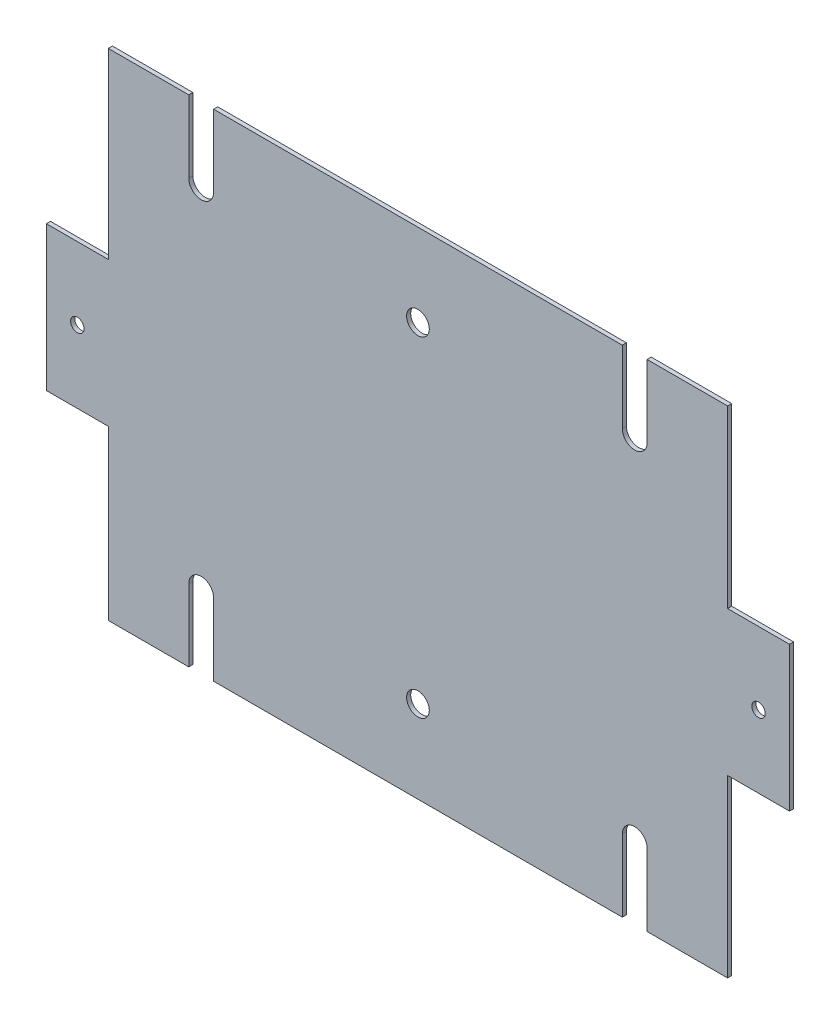
ISO-10303-21;
HEADER;
FILE_DESCRIPTION(('STEP AP214'),'2;1');
FILE_NAME('part.step','',(''),(''),'','','');
FILE_SCHEMA(('AUTOMOTIVE_DESIGN { 1 0 10303 214 1 1 1 1 }'));
ENDSEC;
DATA;
#1=APPLICATION_CONTEXT('core data for automotive mechanical design processes');
#2=APPLICATION_PROTOCOL_DEFINITION('international standard','automotive_design',2000,#1);
#3=PRODUCT_CONTEXT('',#1,'mechanical');
#4=PRODUCT('Part','Part','',(#3));
#5=PRODUCT_RELATED_PRODUCT_CATEGORY('part','',(#4));
#6=PRODUCT_DEFINITION_FORMATION('','',#4);
#7=PRODUCT_DEFINITION_CONTEXT('part definition',#1,'design');
#8=PRODUCT_DEFINITION('design','',#6,#7);
#9=PRODUCT_DEFINITION_SHAPE('','',#8);
#10=(LENGTH_UNIT() NAMED_UNIT(*) SI_UNIT(.MILLI.,.METRE.));
#11=(NAMED_UNIT(*) PLANE_ANGLE_UNIT() SI_UNIT($,.RADIAN.));
#12=(NAMED_UNIT(*) SI_UNIT($,.STERADIAN.) SOLID_ANGLE_UNIT());
#13=UNCERTAINTY_MEASURE_WITH_UNIT(LENGTH_MEASURE(1.E-05),#10,'distance_accuracy_value','');
#14=(GEOMETRIC_REPRESENTATION_CONTEXT(3) GLOBAL_UNCERTAINTY_ASSIGNED_CONTEXT((#13)) GLOBAL_UNIT_ASSIGNED_CONTEXT((#10,
#11,#12)) REPRESENTATION_CONTEXT('',''));
#15=CARTESIAN_POINT('',(0.,0.,0.));
#16=DIRECTION('',(0.,0.,1.));
#17=DIRECTION('',(1.,0.,0.));
#18=AXIS2_PLACEMENT_3D('',#15,#16,#17);
#19=CARTESIAN_POINT('',(23.9488218182788,-146.633764285917,2.));
#20=DIRECTION('',(0.,0.,1.));
#21=DIRECTION('',(1.,0.,0.));
#22=AXIS2_PLACEMENT_3D('',#19,#20,#21);
#23=PLANE('',#22);
#24=CARTESIAN_POINT('',(83.9488218182787,-61.6337642859173,2.));
#25=DIRECTION('',(0.,0.,1.));
#26=DIRECTION('',(1.,0.,0.));
#27=AXIS2_PLACEMENT_3D('',#24,#25,#26);
#28=CIRCLE('',#27,3.25000000000001);
#29=CARTESIAN_POINT('',(87.1988218182787,-61.6337642859173,2.));
#30=VERTEX_POINT('',#29);
#31=EDGE_CURVE('E500',#30,#30,#28,.T.);
#32=ORIENTED_EDGE('',*,*,#31,.F.);
#33=EDGE_LOOP('',(#32));
#34=FACE_BOUND('',#33,.T.);
#35=CARTESIAN_POINT('',(-81.0511781817212,-141.633764285917,2.));
#36=DIRECTION('',(0.,0.,1.));
#37=DIRECTION('',(1.,0.,0.));
#38=AXIS2_PLACEMENT_3D('',#35,#36,#37);
#39=CIRCLE('',#38,5.5);
#40=CARTESIAN_POINT('',(-75.5511781817212,-141.633764285917,2.));
#41=VERTEX_POINT('',#40);
#42=EDGE_CURVE('E255',#41,#41,#39,.T.);
#43=ORIENTED_EDGE('',*,*,#42,.F.);
#44=EDGE_LOOP('',(#43));
#45=FACE_BOUND('',#44,.T.);
#46=DIRECTION('',(0.,1.,0.));
#47=VECTOR('',#46,1.);
#48=CARTESIAN_POINT('',(68.9488218182787,58.3662357140828,2.));
#49=LINE('',#48,#47);
#50=CARTESIAN_POINT('',(68.9488218182788,-26.6337642859172,2.));
#51=VERTEX_POINT('',#50);
#52=CARTESIAN_POINT('',(68.9488218182787,58.3662357140828,2.));
#53=VERTEX_POINT('',#52);
#54=EDGE_CURVE('E306',#51,#53,#49,.T.);
#55=ORIENTED_EDGE('',*,*,#54,.T.);
#56=DIRECTION('',(-1.,0.,0.));
#57=VECTOR('',#56,1.);
#58=CARTESIAN_POINT('',(68.9488218182787,58.3662357140828,2.));
#59=LINE('',#58,#57);
#60=CARTESIAN_POINT('',(29.9488218182788,58.3662357140828,2.));
#61=VERTEX_POINT('',#60);
#62=EDGE_CURVE('E154',#53,#61,#59,.T.);
#63=ORIENTED_EDGE('',*,*,#62,.T.);
#64=DIRECTION('',(0.,-1.,0.));
#65=VECTOR('',#64,1.);
#66=CARTESIAN_POINT('',(29.9488218182788,58.3662357140828,2.));
#67=LINE('',#66,#65);
#68=CARTESIAN_POINT('',(29.9488218182787,23.3662357140828,2.));
#69=VERTEX_POINT('',#68);
#70=EDGE_CURVE('E381',#61,#69,#67,.T.);
#71=ORIENTED_EDGE('',*,*,#70,.T.);
#72=CARTESIAN_POINT('',(23.9488218182787,23.3662357140828,2.));
#73=DIRECTION('',(0.,0.,-1.));
#74=DIRECTION('',(1.,0.,0.));
#75=AXIS2_PLACEMENT_3D('',#72,#73,#74);
#76=CIRCLE('',#75,6.);
#77=CARTESIAN_POINT('',(17.9488218182787,23.3662357140828,2.));
#78=VERTEX_POINT('',#77);
#79=EDGE_CURVE('E400',#69,#78,#76,.T.);
#80=ORIENTED_EDGE('',*,*,#79,.T.);
#81=DIRECTION('',(0.,1.,0.));
#82=VECTOR('',#81,1.);
#83=CARTESIAN_POINT('',(17.9488218182788,58.3662357140828,2.));
#84=LINE('',#83,#82);
#85=CARTESIAN_POINT('',(17.9488218182788,58.3662357140828,2.));
#86=VERTEX_POINT('',#85);
#87=EDGE_CURVE('E397',#78,#86,#84,.T.);
#88=ORIENTED_EDGE('',*,*,#87,.T.);
#89=DIRECTION('',(-1.,0.,0.));
#90=VECTOR('',#89,1.);
#91=CARTESIAN_POINT('',(17.9488218182788,58.3662357140828,2.));
#92=LINE('',#91,#90);
#93=CARTESIAN_POINT('',(-180.051178181721,58.3662357140828,2.));
#94=VERTEX_POINT('',#93);
#95=EDGE_CURVE('E399',#86,#94,#92,.T.);
#96=ORIENTED_EDGE('',*,*,#95,.T.);
#97=DIRECTION('',(0.,-1.,0.));
#98=VECTOR('',#97,1.);
#99=CARTESIAN_POINT('',(-180.051178181721,58.3662357140828,2.));
#100=LINE('',#99,#98);
#101=CARTESIAN_POINT('',(-180.051178181721,23.3662357140828,2.));
#102=VERTEX_POINT('',#101);
#103=EDGE_CURVE('E402',#94,#102,#100,.T.);
#104=ORIENTED_EDGE('',*,*,#103,.T.);
#105=CARTESIAN_POINT('',(-186.051178181721,23.3662357140828,2.));
#106=DIRECTION('',(0.,0.,-1.));
#107=DIRECTION('',(1.,0.,0.));
#108=AXIS2_PLACEMENT_3D('',#105,#106,#107);
#109=CIRCLE('',#108,5.99999999999996);
#110=CARTESIAN_POINT('',(-192.051178181721,23.3662357140828,2.));
#111=VERTEX_POINT('',#110);
#112=EDGE_CURVE('E408',#102,#111,#109,.T.);
#113=ORIENTED_EDGE('',*,*,#112,.T.);
#114=DIRECTION('',(0.,1.,0.));
#115=VECTOR('',#114,1.);
#116=CARTESIAN_POINT('',(-192.051178181721,58.3662357140828,2.));
#117=LINE('',#116,#115);
#118=CARTESIAN_POINT('',(-192.051178181721,58.3662357140828,2.));
#119=VERTEX_POINT('',#118);
#120=EDGE_CURVE('E410',#111,#119,#117,.T.);
#121=ORIENTED_EDGE('',*,*,#120,.T.);
#122=DIRECTION('',(-1.,0.,0.));
#123=VECTOR('',#122,1.);
#124=CARTESIAN_POINT('',(-192.051178181721,58.3662357140828,2.));
#125=LINE('',#124,#123);
#126=CARTESIAN_POINT('',(-231.051178181721,58.3662357140828,2.));
#127=VERTEX_POINT('',#126);
#128=EDGE_CURVE('E412',#119,#127,#125,.T.);
#129=ORIENTED_EDGE('',*,*,#128,.T.);
#130=DIRECTION('',(0.,-1.,0.));
#131=VECTOR('',#130,1.);
#132=CARTESIAN_POINT('',(-231.051178181721,58.3662357140828,2.));
#133=LINE('',#132,#131);
#134=CARTESIAN_POINT('',(-231.051178181721,-30.1798561151079,2.));
#135=VERTEX_POINT('',#134);
#136=EDGE_CURVE('E414',#127,#135,#133,.T.);
#137=ORIENTED_EDGE('',*,*,#136,.T.);
#138=DIRECTION('',(-1.,0.,0.));
#139=VECTOR('',#138,1.);
#140=CARTESIAN_POINT('',(-231.051178181721,-30.1798561151079,2.));
#141=LINE('',#140,#139);
#142=CARTESIAN_POINT('',(-261.051178181721,-30.1798561151079,2.));
#143=VERTEX_POINT('',#142);
#144=EDGE_CURVE('E416',#135,#143,#141,.T.);
#145=ORIENTED_EDGE('',*,*,#144,.T.);
#146=DIRECTION('',(0.,-1.,0.));
#147=VECTOR('',#146,1.);
#148=CARTESIAN_POINT('',(-261.051178181721,-30.1798561151079,2.));
#149=LINE('',#148,#147);
#150=CARTESIAN_POINT('',(-261.051178181721,-100.179856115108,2.));
#151=VERTEX_POINT('',#150);
#152=EDGE_CURVE('E418',#143,#151,#149,.T.);
#153=ORIENTED_EDGE('',*,*,#152,.T.);
#154=DIRECTION('',(1.,0.,0.));
#155=VECTOR('',#154,1.);
#156=CARTESIAN_POINT('',(-261.051178181721,-100.179856115108,2.));
#157=LINE('',#156,#155);
#158=CARTESIAN_POINT('',(-231.051178181721,-100.179856115108,2.));
#159=VERTEX_POINT('',#158);
#160=EDGE_CURVE('E420',#151,#159,#157,.T.);
#161=ORIENTED_EDGE('',*,*,#160,.T.);
#162=DIRECTION('',(0.,-1.,0.));
#163=VECTOR('',#162,1.);
#164=CARTESIAN_POINT('',(-231.051178181721,-100.179856115108,2.));
#165=LINE('',#164,#163);
#166=CARTESIAN_POINT('',(-231.051178181721,-181.633764285917,2.));
#167=VERTEX_POINT('',#166);
#168=EDGE_CURVE('E422',#159,#167,#165,.T.);
#169=ORIENTED_EDGE('',*,*,#168,.T.);
#170=DIRECTION('',(1.,0.,0.));
#171=VECTOR('',#170,1.);
#172=CARTESIAN_POINT('',(-192.051178181721,-181.633764285917,2.));
#173=LINE('',#172,#171);
#174=CARTESIAN_POINT('',(-192.051178181721,-181.633764285917,2.));
#175=VERTEX_POINT('',#174);
#176=EDGE_CURVE('E424',#167,#175,#173,.T.);
#177=ORIENTED_EDGE('',*,*,#176,.T.);
#178=DIRECTION('',(0.,1.,0.));
#179=VECTOR('',#178,1.);
#180=CARTESIAN_POINT('',(-192.051178181721,-181.633764285917,2.));
#181=LINE('',#180,#179);
#182=CARTESIAN_POINT('',(-192.051178181721,-146.633764285917,2.));
#183=VERTEX_POINT('',#182);
#184=EDGE_CURVE('E426',#175,#183,#181,.T.);
#185=ORIENTED_EDGE('',*,*,#184,.T.);
#186=CARTESIAN_POINT('',(-186.051178181721,-146.633764285917,2.));
#187=DIRECTION('',(0.,0.,-1.));
#188=DIRECTION('',(1.,0.,0.));
#189=AXIS2_PLACEMENT_3D('',#186,#187,#188);
#190=CIRCLE('',#189,6.00000000000001);
#191=CARTESIAN_POINT('',(-180.051178181721,-146.633764285917,2.));
#192=VERTEX_POINT('',#191);
#193=EDGE_CURVE('E428',#183,#192,#190,.T.);
#194=ORIENTED_EDGE('',*,*,#193,.T.);
#195=DIRECTION('',(0.,-1.,0.));
#196=VECTOR('',#195,1.);
#197=CARTESIAN_POINT('',(-180.051178181721,-181.633764285917,2.));
#198=LINE('',#197,#196);
#199=CARTESIAN_POINT('',(-180.051178181721,-181.633764285917,2.));
#200=VERTEX_POINT('',#199);
#201=EDGE_CURVE('E430',#192,#200,#198,.T.);
#202=ORIENTED_EDGE('',*,*,#201,.T.);
#203=DIRECTION('',(1.,0.,0.));
#204=VECTOR('',#203,1.);
#205=CARTESIAN_POINT('',(17.9488218182788,-181.633764285917,2.));
#206=LINE('',#205,#204);
#207=CARTESIAN_POINT('',(17.9488218182788,-181.633764285917,2.));
#208=VERTEX_POINT('',#207);
#209=EDGE_CURVE('E432',#200,#208,#206,.T.);
#210=ORIENTED_EDGE('',*,*,#209,.T.);
#211=DIRECTION('',(0.,1.,0.));
#212=VECTOR('',#211,1.);
#213=CARTESIAN_POINT('',(17.9488218182788,-146.633764285917,2.));
#214=LINE('',#213,#212);
#215=CARTESIAN_POINT('',(17.9488218182788,-146.633764285917,2.));
#216=VERTEX_POINT('',#215);
#217=EDGE_CURVE('E434',#208,#216,#214,.T.);
#218=ORIENTED_EDGE('',*,*,#217,.T.);
#219=CARTESIAN_POINT('',(23.9488218182788,-146.633764285917,2.));
#220=DIRECTION('',(0.,0.,-1.));
#221=DIRECTION('',(1.,0.,0.));
#222=AXIS2_PLACEMENT_3D('',#219,#220,#221);
#223=CIRCLE('',#222,6.00000000000001);
#224=CARTESIAN_POINT('',(29.9488218182788,-146.633764285917,2.));
#225=VERTEX_POINT('',#224);
#226=EDGE_CURVE('E436',#216,#225,#223,.T.);
#227=ORIENTED_EDGE('',*,*,#226,.T.);
#228=DIRECTION('',(0.,-1.,0.));
#229=VECTOR('',#228,1.);
#230=CARTESIAN_POINT('',(29.9488218182788,-146.633764285917,2.));
#231=LINE('',#230,#229);
#232=CARTESIAN_POINT('',(29.9488218182788,-181.633764285917,2.));
#233=VERTEX_POINT('',#232);
#234=EDGE_CURVE('E438',#225,#233,#231,.T.);
#235=ORIENTED_EDGE('',*,*,#234,.T.);
#236=DIRECTION('',(1.,0.,0.));
#237=VECTOR('',#236,1.);
#238=CARTESIAN_POINT('',(68.9488218182788,-181.633764285917,2.));
#239=LINE('',#238,#237);
#240=CARTESIAN_POINT('',(68.9488218182788,-181.633764285917,2.));
#241=VERTEX_POINT('',#240);
#242=EDGE_CURVE('E440',#233,#241,#239,.T.);
#243=ORIENTED_EDGE('',*,*,#242,.T.);
#244=DIRECTION('',(0.,1.,0.));
#245=VECTOR('',#244,1.);
#246=CARTESIAN_POINT('',(68.9488218182788,-96.6337642859173,2.));
#247=LINE('',#246,#245);
#248=CARTESIAN_POINT('',(68.9488218182788,-96.6337642859173,2.));
#249=VERTEX_POINT('',#248);
#250=EDGE_CURVE('E233',#241,#249,#247,.T.);
#251=ORIENTED_EDGE('',*,*,#250,.T.);
#252=DIRECTION('',(1.,0.,0.));
#253=VECTOR('',#252,1.);
#254=CARTESIAN_POINT('',(98.9488218182788,-96.6337642859172,2.));
#255=LINE('',#254,#253);
#256=CARTESIAN_POINT('',(98.9488218182788,-96.6337642859172,2.));
#257=VERTEX_POINT('',#256);
#258=EDGE_CURVE('E227',#249,#257,#255,.T.);
#259=ORIENTED_EDGE('',*,*,#258,.T.);
#260=DIRECTION('',(0.,1.,0.));
#261=VECTOR('',#260,1.);
#262=CARTESIAN_POINT('',(98.9488218182788,-26.6337642859172,2.));
#263=LINE('',#262,#261);
#264=CARTESIAN_POINT('',(98.9488218182788,-26.6337642859172,2.));
#265=VERTEX_POINT('',#264);
#266=EDGE_CURVE('E231',#257,#265,#263,.T.);
#267=ORIENTED_EDGE('',*,*,#266,.T.);
#268=DIRECTION('',(-1.,0.,0.));
#269=VECTOR('',#268,1.);
#270=CARTESIAN_POINT('',(68.9488218182788,-26.6337642859172,2.));
#271=LINE('',#270,#269);
#272=EDGE_CURVE('E51',#265,#51,#271,.T.);
#273=ORIENTED_EDGE('',*,*,#272,.T.);
#274=EDGE_LOOP('',(#55,#63,#71,#80,#88,#96,#104,#113,#121,#129,#137,#145,#153,#161,#169,#177,
#185,#194,#202,#210,#218,#227,#235,#243,#251,#259,#267,#273));
#275=FACE_BOUND('',#274,.T.);
#276=CARTESIAN_POINT('',(-81.0511781817213,18.3662357140828,2.));
#277=DIRECTION('',(0.,0.,1.));
#278=DIRECTION('',(1.,0.,0.));
#279=AXIS2_PLACEMENT_3D('',#276,#277,#278);
#280=CIRCLE('',#279,5.5);
#281=CARTESIAN_POINT('',(-75.5511781817212,18.3662357140828,2.));
#282=VERTEX_POINT('',#281);
#283=EDGE_CURVE('E506',#282,#282,#280,.T.);
#284=ORIENTED_EDGE('',*,*,#283,.F.);
#285=EDGE_LOOP('',(#284));
#286=FACE_BOUND('',#285,.T.);
#287=CARTESIAN_POINT('',(-246.051178181721,-65.1798561151079,2.));
#288=DIRECTION('',(0.,0.,1.));
#289=DIRECTION('',(1.,0.,0.));
#290=AXIS2_PLACEMENT_3D('',#287,#288,#289);
#291=CIRCLE('',#290,3.25000000000001);
#292=CARTESIAN_POINT('',(-242.801178181721,-65.1798561151079,2.));
#293=VERTEX_POINT('',#292);
#294=EDGE_CURVE('E491',#293,#293,#291,.T.);
#295=ORIENTED_EDGE('',*,*,#294,.F.);
#296=EDGE_LOOP('',(#295));
#297=FACE_BOUND('',#296,.T.);
#298=ADVANCED_FACE('F34',(#34,#45,#275,#286,#297),#23,.T.);
#299=CARTESIAN_POINT('',(23.9488218182788,-146.633764285917,0.));
#300=DIRECTION('',(0.,0.,1.));
#301=DIRECTION('',(1.,0.,0.));
#302=AXIS2_PLACEMENT_3D('',#299,#300,#301);
#303=PLANE('',#302);
#304=DIRECTION('',(0.,1.,0.));
#305=VECTOR('',#304,1.);
#306=CARTESIAN_POINT('',(68.9488218182787,58.3662357140828,0.));
#307=LINE('',#306,#305);
#308=CARTESIAN_POINT('',(68.9488218182788,-26.6337642859172,0.));
#309=VERTEX_POINT('',#308);
#310=CARTESIAN_POINT('',(68.9488218182787,58.3662357140828,0.));
#311=VERTEX_POINT('',#310);
#312=EDGE_CURVE('E251',#309,#311,#307,.T.);
#313=ORIENTED_EDGE('',*,*,#312,.F.);
#314=DIRECTION('',(-1.,0.,0.));
#315=VECTOR('',#314,1.);
#316=CARTESIAN_POINT('',(68.9488218182788,-26.6337642859172,0.));
#317=LINE('',#316,#315);
#318=CARTESIAN_POINT('',(98.9488218182788,-26.6337642859172,0.));
#319=VERTEX_POINT('',#318);
#320=EDGE_CURVE('E146',#319,#309,#317,.T.);
#321=ORIENTED_EDGE('',*,*,#320,.F.);
#322=DIRECTION('',(0.,1.,0.));
#323=VECTOR('',#322,1.);
#324=CARTESIAN_POINT('',(98.9488218182788,-26.6337642859172,0.));
#325=LINE('',#324,#323);
#326=CARTESIAN_POINT('',(98.9488218182788,-96.6337642859172,0.));
#327=VERTEX_POINT('',#326);
#328=EDGE_CURVE('E140',#327,#319,#325,.T.);
#329=ORIENTED_EDGE('',*,*,#328,.F.);
#330=DIRECTION('',(1.,0.,0.));
#331=VECTOR('',#330,1.);
#332=CARTESIAN_POINT('',(98.9488218182788,-96.6337642859172,0.));
#333=LINE('',#332,#331);
#334=CARTESIAN_POINT('',(68.9488218182788,-96.6337642859173,0.));
#335=VERTEX_POINT('',#334);
#336=EDGE_CURVE('E241',#335,#327,#333,.T.);
#337=ORIENTED_EDGE('',*,*,#336,.F.);
#338=DIRECTION('',(0.,1.,0.));
#339=VECTOR('',#338,1.);
#340=CARTESIAN_POINT('',(68.9488218182788,-96.6337642859173,0.));
#341=LINE('',#340,#339);
#342=CARTESIAN_POINT('',(68.9488218182788,-181.633764285917,0.));
#343=VERTEX_POINT('',#342);
#344=EDGE_CURVE('E301',#343,#335,#341,.T.);
#345=ORIENTED_EDGE('',*,*,#344,.F.);
#346=DIRECTION('',(1.,0.,0.));
#347=VECTOR('',#346,1.);
#348=CARTESIAN_POINT('',(68.9488218182788,-181.633764285917,0.));
#349=LINE('',#348,#347);
#350=CARTESIAN_POINT('',(29.9488218182788,-181.633764285917,0.));
#351=VERTEX_POINT('',#350);
#352=EDGE_CURVE('E299',#351,#343,#349,.T.);
#353=ORIENTED_EDGE('',*,*,#352,.F.);
#354=DIRECTION('',(0.,-1.,0.));
#355=VECTOR('',#354,1.);
#356=CARTESIAN_POINT('',(29.9488218182788,-146.633764285917,0.));
#357=LINE('',#356,#355);
#358=CARTESIAN_POINT('',(29.9488218182788,-146.633764285917,0.));
#359=VERTEX_POINT('',#358);
#360=EDGE_CURVE('E297',#359,#351,#357,.T.);
#361=ORIENTED_EDGE('',*,*,#360,.F.);
#362=CARTESIAN_POINT('',(23.9488218182788,-146.633764285917,0.));
#363=DIRECTION('',(0.,0.,-1.));
#364=DIRECTION('',(1.,0.,0.));
#365=AXIS2_PLACEMENT_3D('',#362,#363,#364);
#366=CIRCLE('',#365,6.00000000000001);
#367=CARTESIAN_POINT('',(17.9488218182788,-146.633764285917,0.));
#368=VERTEX_POINT('',#367);
#369=EDGE_CURVE('E295',#368,#359,#366,.T.);
#370=ORIENTED_EDGE('',*,*,#369,.F.);
#371=DIRECTION('',(0.,1.,0.));
#372=VECTOR('',#371,1.);
#373=CARTESIAN_POINT('',(17.9488218182788,-146.633764285917,0.));
#374=LINE('',#373,#372);
#375=CARTESIAN_POINT('',(17.9488218182788,-181.633764285917,0.));
#376=VERTEX_POINT('',#375);
#377=EDGE_CURVE('E293',#376,#368,#374,.T.);
#378=ORIENTED_EDGE('',*,*,#377,.F.);
#379=DIRECTION('',(1.,0.,0.));
#380=VECTOR('',#379,1.);
#381=CARTESIAN_POINT('',(17.9488218182788,-181.633764285917,0.));
#382=LINE('',#381,#380);
#383=CARTESIAN_POINT('',(-180.051178181721,-181.633764285917,0.));
#384=VERTEX_POINT('',#383);
#385=EDGE_CURVE('E291',#384,#376,#382,.T.);
#386=ORIENTED_EDGE('',*,*,#385,.F.);
#387=DIRECTION('',(0.,-1.,0.));
#388=VECTOR('',#387,1.);
#389=CARTESIAN_POINT('',(-180.051178181721,-181.633764285917,0.));
#390=LINE('',#389,#388);
#391=CARTESIAN_POINT('',(-180.051178181721,-146.633764285917,0.));
#392=VERTEX_POINT('',#391);
#393=EDGE_CURVE('E289',#392,#384,#390,.T.);
#394=ORIENTED_EDGE('',*,*,#393,.F.);
#395=CARTESIAN_POINT('',(-186.051178181721,-146.633764285917,0.));
#396=DIRECTION('',(0.,0.,-1.));
#397=DIRECTION('',(1.,0.,0.));
#398=AXIS2_PLACEMENT_3D('',#395,#396,#397);
#399=CIRCLE('',#398,6.00000000000001);
#400=CARTESIAN_POINT('',(-192.051178181721,-146.633764285917,0.));
#401=VERTEX_POINT('',#400);
#402=EDGE_CURVE('E287',#401,#392,#399,.T.);
#403=ORIENTED_EDGE('',*,*,#402,.F.);
#404=DIRECTION('',(0.,1.,0.));
#405=VECTOR('',#404,1.);
#406=CARTESIAN_POINT('',(-192.051178181721,-181.633764285917,0.));
#407=LINE('',#406,#405);
#408=CARTESIAN_POINT('',(-192.051178181721,-181.633764285917,0.));
#409=VERTEX_POINT('',#408);
#410=EDGE_CURVE('E285',#409,#401,#407,.T.);
#411=ORIENTED_EDGE('',*,*,#410,.F.);
#412=DIRECTION('',(1.,0.,0.));
#413=VECTOR('',#412,1.);
#414=CARTESIAN_POINT('',(-192.051178181721,-181.633764285917,0.));
#415=LINE('',#414,#413);
#416=CARTESIAN_POINT('',(-231.051178181721,-181.633764285917,0.));
#417=VERTEX_POINT('',#416);
#418=EDGE_CURVE('E283',#417,#409,#415,.T.);
#419=ORIENTED_EDGE('',*,*,#418,.F.);
#420=DIRECTION('',(0.,-1.,0.));
#421=VECTOR('',#420,1.);
#422=CARTESIAN_POINT('',(-231.051178181721,-100.179856115108,0.));
#423=LINE('',#422,#421);
#424=CARTESIAN_POINT('',(-231.051178181721,-100.179856115108,0.));
#425=VERTEX_POINT('',#424);
#426=EDGE_CURVE('E281',#425,#417,#423,.T.);
#427=ORIENTED_EDGE('',*,*,#426,.F.);
#428=DIRECTION('',(1.,0.,0.));
#429=VECTOR('',#428,1.);
#430=CARTESIAN_POINT('',(-261.051178181721,-100.179856115108,0.));
#431=LINE('',#430,#429);
#432=CARTESIAN_POINT('',(-261.051178181721,-100.179856115108,0.));
#433=VERTEX_POINT('',#432);
#434=EDGE_CURVE('E279',#433,#425,#431,.T.);
#435=ORIENTED_EDGE('',*,*,#434,.F.);
#436=DIRECTION('',(0.,-1.,0.));
#437=VECTOR('',#436,1.);
#438=CARTESIAN_POINT('',(-261.051178181721,-30.1798561151079,0.));
#439=LINE('',#438,#437);
#440=CARTESIAN_POINT('',(-261.051178181721,-30.1798561151079,0.));
#441=VERTEX_POINT('',#440);
#442=EDGE_CURVE('E277',#441,#433,#439,.T.);
#443=ORIENTED_EDGE('',*,*,#442,.F.);
#444=DIRECTION('',(-1.,0.,0.));
#445=VECTOR('',#444,1.);
#446=CARTESIAN_POINT('',(-231.051178181721,-30.1798561151079,0.));
#447=LINE('',#446,#445);
#448=CARTESIAN_POINT('',(-231.051178181721,-30.1798561151079,0.));
#449=VERTEX_POINT('',#448);
#450=EDGE_CURVE('E275',#449,#441,#447,.T.);
#451=ORIENTED_EDGE('',*,*,#450,.F.);
#452=DIRECTION('',(0.,-1.,0.));
#453=VECTOR('',#452,1.);
#454=CARTESIAN_POINT('',(-231.051178181721,58.3662357140828,0.));
#455=LINE('',#454,#453);
#456=CARTESIAN_POINT('',(-231.051178181721,58.3662357140828,0.));
#457=VERTEX_POINT('',#456);
#458=EDGE_CURVE('E273',#457,#449,#455,.T.);
#459=ORIENTED_EDGE('',*,*,#458,.F.);
#460=DIRECTION('',(-1.,0.,0.));
#461=VECTOR('',#460,1.);
#462=CARTESIAN_POINT('',(-192.051178181721,58.3662357140828,0.));
#463=LINE('',#462,#461);
#464=CARTESIAN_POINT('',(-192.051178181721,58.3662357140828,0.));
#465=VERTEX_POINT('',#464);
#466=EDGE_CURVE('E271',#465,#457,#463,.T.);
#467=ORIENTED_EDGE('',*,*,#466,.F.);
#468=DIRECTION('',(0.,1.,0.));
#469=VECTOR('',#468,1.);
#470=CARTESIAN_POINT('',(-192.051178181721,58.3662357140828,0.));
#471=LINE('',#470,#469);
#472=CARTESIAN_POINT('',(-192.051178181721,23.3662357140828,0.));
#473=VERTEX_POINT('',#472);
#474=EDGE_CURVE('E269',#473,#465,#471,.T.);
#475=ORIENTED_EDGE('',*,*,#474,.F.);
#476=CARTESIAN_POINT('',(-186.051178181721,23.3662357140828,0.));
#477=DIRECTION('',(0.,0.,-1.));
#478=DIRECTION('',(1.,0.,0.));
#479=AXIS2_PLACEMENT_3D('',#476,#477,#478);
#480=CIRCLE('',#479,5.99999999999996);
#481=CARTESIAN_POINT('',(-180.051178181721,23.3662357140828,0.));
#482=VERTEX_POINT('',#481);
#483=EDGE_CURVE('E267',#482,#473,#480,.T.);
#484=ORIENTED_EDGE('',*,*,#483,.F.);
#485=DIRECTION('',(0.,-1.,0.));
#486=VECTOR('',#485,1.);
#487=CARTESIAN_POINT('',(-180.051178181721,58.3662357140828,0.));
#488=LINE('',#487,#486);
#489=CARTESIAN_POINT('',(-180.051178181721,58.3662357140828,0.));
#490=VERTEX_POINT('',#489);
#491=EDGE_CURVE('E265',#490,#482,#488,.T.);
#492=ORIENTED_EDGE('',*,*,#491,.F.);
#493=DIRECTION('',(-1.,0.,0.));
#494=VECTOR('',#493,1.);
#495=CARTESIAN_POINT('',(17.9488218182788,58.3662357140828,0.));
#496=LINE('',#495,#494);
#497=CARTESIAN_POINT('',(17.9488218182788,58.3662357140828,0.));
#498=VERTEX_POINT('',#497);
#499=EDGE_CURVE('E263',#498,#490,#496,.T.);
#500=ORIENTED_EDGE('',*,*,#499,.F.);
#501=DIRECTION('',(0.,1.,0.));
#502=VECTOR('',#501,1.);
#503=CARTESIAN_POINT('',(17.9488218182788,58.3662357140828,0.));
#504=LINE('',#503,#502);
#505=CARTESIAN_POINT('',(17.9488218182787,23.3662357140828,0.));
#506=VERTEX_POINT('',#505);
#507=EDGE_CURVE('E261',#506,#498,#504,.T.);
#508=ORIENTED_EDGE('',*,*,#507,.F.);
#509=CARTESIAN_POINT('',(23.9488218182787,23.3662357140828,0.));
#510=DIRECTION('',(0.,0.,-1.));
#511=DIRECTION('',(1.,0.,0.));
#512=AXIS2_PLACEMENT_3D('',#509,#510,#511);
#513=CIRCLE('',#512,6.);
#514=CARTESIAN_POINT('',(29.9488218182787,23.3662357140828,0.));
#515=VERTEX_POINT('',#514);
#516=EDGE_CURVE('E259',#515,#506,#513,.T.);
#517=ORIENTED_EDGE('',*,*,#516,.F.);
#518=DIRECTION('',(0.,-1.,0.));
#519=VECTOR('',#518,1.);
#520=CARTESIAN_POINT('',(29.9488218182788,58.3662357140828,0.));
#521=LINE('',#520,#519);
#522=CARTESIAN_POINT('',(29.9488218182788,58.3662357140828,0.));
#523=VERTEX_POINT('',#522);
#524=EDGE_CURVE('E257',#523,#515,#521,.T.);
#525=ORIENTED_EDGE('',*,*,#524,.F.);
#526=DIRECTION('',(-1.,0.,0.));
#527=VECTOR('',#526,1.);
#528=CARTESIAN_POINT('',(68.9488218182787,58.3662357140828,0.));
#529=LINE('',#528,#527);
#530=EDGE_CURVE('E254',#311,#523,#529,.T.);
#531=ORIENTED_EDGE('',*,*,#530,.F.);
#532=EDGE_LOOP('',(#313,#321,#329,#337,#345,#353,#361,#370,#378,#386,#394,#403,#411,#419,#427,
#435,#443,#451,#459,#467,#475,#484,#492,#500,#508,#517,#525,#531));
#533=FACE_BOUND('',#532,.T.);
#534=CARTESIAN_POINT('',(-81.0511781817212,-141.633764285917,0.));
#535=DIRECTION('',(0.,0.,1.));
#536=DIRECTION('',(1.,0.,0.));
#537=AXIS2_PLACEMENT_3D('',#534,#535,#536);
#538=CIRCLE('',#537,5.5);
#539=CARTESIAN_POINT('',(-75.5511781817212,-141.633764285917,0.));
#540=VERTEX_POINT('',#539);
#541=EDGE_CURVE('E509',#540,#540,#538,.T.);
#542=ORIENTED_EDGE('',*,*,#541,.T.);
#543=EDGE_LOOP('',(#542));
#544=FACE_BOUND('',#543,.T.);
#545=CARTESIAN_POINT('',(-81.0511781817213,18.3662357140828,0.));
#546=DIRECTION('',(0.,0.,1.));
#547=DIRECTION('',(1.,0.,0.));
#548=AXIS2_PLACEMENT_3D('',#545,#546,#547);
#549=CIRCLE('',#548,5.5);
#550=CARTESIAN_POINT('',(-75.5511781817212,18.3662357140828,0.));
#551=VERTEX_POINT('',#550);
#552=EDGE_CURVE('E503',#551,#551,#549,.T.);
#553=ORIENTED_EDGE('',*,*,#552,.T.);
#554=EDGE_LOOP('',(#553));
#555=FACE_BOUND('',#554,.T.);
#556=CARTESIAN_POINT('',(83.9488218182787,-61.6337642859173,0.));
#557=DIRECTION('',(0.,0.,1.));
#558=DIRECTION('',(1.,0.,0.));
#559=AXIS2_PLACEMENT_3D('',#556,#557,#558);
#560=CIRCLE('',#559,3.25000000000001);
#561=CARTESIAN_POINT('',(87.1988218182787,-61.6337642859173,0.));
#562=VERTEX_POINT('',#561);
#563=EDGE_CURVE('E497',#562,#562,#560,.T.);
#564=ORIENTED_EDGE('',*,*,#563,.T.);
#565=EDGE_LOOP('',(#564));
#566=FACE_BOUND('',#565,.T.);
#567=CARTESIAN_POINT('',(-246.051178181721,-65.1798561151079,0.));
#568=DIRECTION('',(0.,0.,1.));
#569=DIRECTION('',(1.,0.,0.));
#570=AXIS2_PLACEMENT_3D('',#567,#568,#569);
#571=CIRCLE('',#570,3.25000000000001);
#572=CARTESIAN_POINT('',(-242.801178181721,-65.1798561151079,0.));
#573=VERTEX_POINT('',#572);
#574=EDGE_CURVE('E494',#573,#573,#571,.T.);
#575=ORIENTED_EDGE('',*,*,#574,.T.);
#576=EDGE_LOOP('',(#575));
#577=FACE_BOUND('',#576,.T.);
#578=ADVANCED_FACE('F385',(#533,#544,#555,#566,#577),#303,.F.);
#579=CARTESIAN_POINT('',(68.9488218182787,58.3662357140828,2.));
#580=DIRECTION('',(-1.,0.,0.));
#581=DIRECTION('',(0.,-1.,0.));
#582=AXIS2_PLACEMENT_3D('',#579,#580,#581);
#583=PLANE('',#582);
#584=ORIENTED_EDGE('',*,*,#312,.T.);
#585=DIRECTION('',(0.,0.,-1.));
#586=VECTOR('',#585,1.);
#587=CARTESIAN_POINT('',(68.9488218182787,58.3662357140828,2.));
#588=LINE('',#587,#586);
#589=EDGE_CURVE('E11',#53,#311,#588,.T.);
#590=ORIENTED_EDGE('',*,*,#589,.F.);
#591=ORIENTED_EDGE('',*,*,#54,.F.);
#592=DIRECTION('',(0.,0.,-1.));
#593=VECTOR('',#592,1.);
#594=CARTESIAN_POINT('',(68.9488218182788,-26.6337642859172,2.));
#595=LINE('',#594,#593);
#596=EDGE_CURVE('E247',#51,#309,#595,.T.);
#597=ORIENTED_EDGE('',*,*,#596,.T.);
#598=EDGE_LOOP('',(#584,#590,#591,#597));
#599=FACE_BOUND('',#598,.T.);
#600=ADVANCED_FACE('F36',(#599),#583,.F.);
#601=CARTESIAN_POINT('',(68.9488218182787,58.3662357140828,2.));
#602=DIRECTION('',(0.,-1.,0.));
#603=DIRECTION('',(1.,0.,0.));
#604=AXIS2_PLACEMENT_3D('',#601,#602,#603);
#605=PLANE('',#604);
#606=ORIENTED_EDGE('',*,*,#530,.T.);
#607=DIRECTION('',(0.,0.,-1.));
#608=VECTOR('',#607,1.);
#609=CARTESIAN_POINT('',(29.9488218182788,58.3662357140828,2.));
#610=LINE('',#609,#608);
#611=EDGE_CURVE('E43',#61,#523,#610,.T.);
#612=ORIENTED_EDGE('',*,*,#611,.F.);
#613=ORIENTED_EDGE('',*,*,#62,.F.);
#614=ORIENTED_EDGE('',*,*,#589,.T.);
#615=EDGE_LOOP('',(#606,#612,#613,#614));
#616=FACE_BOUND('',#615,.T.);
#617=ADVANCED_FACE('F779',(#616),#605,.F.);
#618=CARTESIAN_POINT('',(29.9488218182788,58.3662357140828,2.));
#619=DIRECTION('',(1.,0.,0.));
#620=DIRECTION('',(0.,1.,0.));
#621=AXIS2_PLACEMENT_3D('',#618,#619,#620);
#622=PLANE('',#621);
#623=ORIENTED_EDGE('',*,*,#524,.T.);
#624=DIRECTION('',(0.,0.,-1.));
#625=VECTOR('',#624,1.);
#626=CARTESIAN_POINT('',(29.9488218182787,23.3662357140828,2.));
#627=LINE('',#626,#625);
#628=EDGE_CURVE('E373',#69,#515,#627,.T.);
#629=ORIENTED_EDGE('',*,*,#628,.F.);
#630=ORIENTED_EDGE('',*,*,#70,.F.);
#631=ORIENTED_EDGE('',*,*,#611,.T.);
#632=EDGE_LOOP('',(#623,#629,#630,#631));
#633=FACE_BOUND('',#632,.T.);
#634=ADVANCED_FACE('F379',(#633),#622,.F.);
#635=CARTESIAN_POINT('',(23.9488218182787,23.3662357140828,2.));
#636=DIRECTION('',(0.,0.,-1.));
#637=DIRECTION('',(-1.,0.,0.));
#638=AXIS2_PLACEMENT_3D('',#635,#636,#637);
#639=CYLINDRICAL_SURFACE('',#638,6.);
#640=ORIENTED_EDGE('',*,*,#516,.T.);
#641=DIRECTION('',(0.,0.,-1.));
#642=VECTOR('',#641,1.);
#643=CARTESIAN_POINT('',(17.9488218182787,23.3662357140828,2.));
#644=LINE('',#643,#642);
#645=EDGE_CURVE('E370',#78,#506,#644,.T.);
#646=ORIENTED_EDGE('',*,*,#645,.F.);
#647=ORIENTED_EDGE('',*,*,#79,.F.);
#648=ORIENTED_EDGE('',*,*,#628,.T.);
#649=EDGE_LOOP('',(#640,#646,#647,#648));
#650=FACE_BOUND('',#649,.T.);
#651=ADVANCED_FACE('F391',(#650),#639,.F.);
#652=CARTESIAN_POINT('',(17.9488218182788,58.3662357140828,2.));
#653=DIRECTION('',(-1.,0.,0.));
#654=DIRECTION('',(0.,-1.,0.));
#655=AXIS2_PLACEMENT_3D('',#652,#653,#654);
#656=PLANE('',#655);
#657=ORIENTED_EDGE('',*,*,#507,.T.);
#658=DIRECTION('',(0.,0.,-1.));
#659=VECTOR('',#658,1.);
#660=CARTESIAN_POINT('',(17.9488218182788,58.3662357140828,2.));
#661=LINE('',#660,#659);
#662=EDGE_CURVE('E367',#86,#498,#661,.T.);
#663=ORIENTED_EDGE('',*,*,#662,.F.);
#664=ORIENTED_EDGE('',*,*,#87,.F.);
#665=ORIENTED_EDGE('',*,*,#645,.T.);
#666=EDGE_LOOP('',(#657,#663,#664,#665));
#667=FACE_BOUND('',#666,.T.);
#668=ADVANCED_FACE('F395',(#667),#656,.F.);
#669=CARTESIAN_POINT('',(17.9488218182788,58.3662357140828,2.));
#670=DIRECTION('',(0.,-1.,0.));
#671=DIRECTION('',(1.,0.,0.));
#672=AXIS2_PLACEMENT_3D('',#669,#670,#671);
#673=PLANE('',#672);
#674=ORIENTED_EDGE('',*,*,#499,.T.);
#675=DIRECTION('',(0.,0.,-1.));
#676=VECTOR('',#675,1.);
#677=CARTESIAN_POINT('',(-180.051178181721,58.3662357140828,2.));
#678=LINE('',#677,#676);
#679=EDGE_CURVE('E364',#94,#490,#678,.T.);
#680=ORIENTED_EDGE('',*,*,#679,.F.);
#681=ORIENTED_EDGE('',*,*,#95,.F.);
#682=ORIENTED_EDGE('',*,*,#662,.T.);
#683=EDGE_LOOP('',(#674,#680,#681,#682));
#684=FACE_BOUND('',#683,.T.);
#685=ADVANCED_FACE('F744',(#684),#673,.F.);
#686=CARTESIAN_POINT('',(-180.051178181721,58.3662357140828,2.));
#687=DIRECTION('',(1.,0.,0.));
#688=DIRECTION('',(0.,0.,-1.));
#689=AXIS2_PLACEMENT_3D('',#686,#687,#688);
#690=PLANE('',#689);
#691=ORIENTED_EDGE('',*,*,#491,.T.);
#692=DIRECTION('',(0.,0.,-1.));
#693=VECTOR('',#692,1.);
#694=CARTESIAN_POINT('',(-180.051178181721,23.3662357140828,2.));
#695=LINE('',#694,#693);
#696=EDGE_CURVE('E361',#102,#482,#695,.T.);
#697=ORIENTED_EDGE('',*,*,#696,.F.);
#698=ORIENTED_EDGE('',*,*,#103,.F.);
#699=ORIENTED_EDGE('',*,*,#679,.T.);
#700=EDGE_LOOP('',(#691,#697,#698,#699));
#701=FACE_BOUND('',#700,.T.);
#702=ADVANCED_FACE('F734',(#701),#690,.F.);
#703=CARTESIAN_POINT('',(-186.051178181721,23.3662357140828,2.));
#704=DIRECTION('',(0.,0.,-1.));
#705=DIRECTION('',(-1.,0.,0.));
#706=AXIS2_PLACEMENT_3D('',#703,#704,#705);
#707=CYLINDRICAL_SURFACE('',#706,5.99999999999996);
#708=ORIENTED_EDGE('',*,*,#483,.T.);
#709=DIRECTION('',(0.,0.,-1.));
#710=VECTOR('',#709,1.);
#711=CARTESIAN_POINT('',(-192.051178181721,23.3662357140828,2.));
#712=LINE('',#711,#710);
#713=EDGE_CURVE('E358',#111,#473,#712,.T.);
#714=ORIENTED_EDGE('',*,*,#713,.F.);
#715=ORIENTED_EDGE('',*,*,#112,.F.);
#716=ORIENTED_EDGE('',*,*,#696,.T.);
#717=EDGE_LOOP('',(#708,#714,#715,#716));
#718=FACE_BOUND('',#717,.T.);
#719=ADVANCED_FACE('F724',(#718),#707,.F.);
#720=CARTESIAN_POINT('',(-192.051178181721,58.3662357140828,2.));
#721=DIRECTION('',(-1.,0.,0.));
#722=DIRECTION('',(0.,-1.,0.));
#723=AXIS2_PLACEMENT_3D('',#720,#721,#722);
#724=PLANE('',#723);
#725=ORIENTED_EDGE('',*,*,#474,.T.);
#726=DIRECTION('',(0.,0.,-1.));
#727=VECTOR('',#726,1.);
#728=CARTESIAN_POINT('',(-192.051178181721,58.3662357140828,2.));
#729=LINE('',#728,#727);
#730=EDGE_CURVE('E355',#119,#465,#729,.T.);
#731=ORIENTED_EDGE('',*,*,#730,.F.);
#732=ORIENTED_EDGE('',*,*,#120,.F.);
#733=ORIENTED_EDGE('',*,*,#713,.T.);
#734=EDGE_LOOP('',(#725,#731,#732,#733));
#735=FACE_BOUND('',#734,.T.);
#736=ADVANCED_FACE('F714',(#735),#724,.F.);
#737=CARTESIAN_POINT('',(-192.051178181721,58.3662357140828,2.));
#738=DIRECTION('',(0.,-1.,0.));
#739=DIRECTION('',(0.,0.,-1.));
#740=AXIS2_PLACEMENT_3D('',#737,#738,#739);
#741=PLANE('',#740);
#742=ORIENTED_EDGE('',*,*,#466,.T.);
#743=DIRECTION('',(0.,0.,-1.));
#744=VECTOR('',#743,1.);
#745=CARTESIAN_POINT('',(-231.051178181721,58.3662357140828,2.));
#746=LINE('',#745,#744);
#747=EDGE_CURVE('E352',#127,#457,#746,.T.);
#748=ORIENTED_EDGE('',*,*,#747,.F.);
#749=ORIENTED_EDGE('',*,*,#128,.F.);
#750=ORIENTED_EDGE('',*,*,#730,.T.);
#751=EDGE_LOOP('',(#742,#748,#749,#750));
#752=FACE_BOUND('',#751,.T.);
#753=ADVANCED_FACE('F704',(#752),#741,.F.);
#754=CARTESIAN_POINT('',(-231.051178181721,58.3662357140828,2.));
#755=DIRECTION('',(1.,0.,0.));
#756=DIRECTION('',(0.,1.,0.));
#757=AXIS2_PLACEMENT_3D('',#754,#755,#756);
#758=PLANE('',#757);
#759=ORIENTED_EDGE('',*,*,#458,.T.);
#760=DIRECTION('',(0.,0.,-1.));
#761=VECTOR('',#760,1.);
#762=CARTESIAN_POINT('',(-231.051178181721,-30.1798561151079,2.));
#763=LINE('',#762,#761);
#764=EDGE_CURVE('E349',#135,#449,#763,.T.);
#765=ORIENTED_EDGE('',*,*,#764,.F.);
#766=ORIENTED_EDGE('',*,*,#136,.F.);
#767=ORIENTED_EDGE('',*,*,#747,.T.);
#768=EDGE_LOOP('',(#759,#765,#766,#767));
#769=FACE_BOUND('',#768,.T.);
#770=ADVANCED_FACE('F694',(#769),#758,.F.);
#771=CARTESIAN_POINT('',(-231.051178181721,-30.1798561151079,2.));
#772=DIRECTION('',(0.,-1.,0.));
#773=DIRECTION('',(1.,0.,0.));
#774=AXIS2_PLACEMENT_3D('',#771,#772,#773);
#775=PLANE('',#774);
#776=ORIENTED_EDGE('',*,*,#450,.T.);
#777=DIRECTION('',(0.,0.,-1.));
#778=VECTOR('',#777,1.);
#779=CARTESIAN_POINT('',(-261.051178181721,-30.1798561151079,2.));
#780=LINE('',#779,#778);
#781=EDGE_CURVE('E346',#143,#441,#780,.T.);
#782=ORIENTED_EDGE('',*,*,#781,.F.);
#783=ORIENTED_EDGE('',*,*,#144,.F.);
#784=ORIENTED_EDGE('',*,*,#764,.T.);
#785=EDGE_LOOP('',(#776,#782,#783,#784));
#786=FACE_BOUND('',#785,.T.);
#787=ADVANCED_FACE('F684',(#786),#775,.F.);
#788=CARTESIAN_POINT('',(-261.051178181721,-30.1798561151079,2.));
#789=DIRECTION('',(1.,0.,0.));
#790=DIRECTION('',(0.,0.,-1.));
#791=AXIS2_PLACEMENT_3D('',#788,#789,#790);
#792=PLANE('',#791);
#793=ORIENTED_EDGE('',*,*,#442,.T.);
#794=DIRECTION('',(0.,0.,-1.));
#795=VECTOR('',#794,1.);
#796=CARTESIAN_POINT('',(-261.051178181721,-100.179856115108,2.));
#797=LINE('',#796,#795);
#798=EDGE_CURVE('E343',#151,#433,#797,.T.);
#799=ORIENTED_EDGE('',*,*,#798,.F.);
#800=ORIENTED_EDGE('',*,*,#152,.F.);
#801=ORIENTED_EDGE('',*,*,#781,.T.);
#802=EDGE_LOOP('',(#793,#799,#800,#801));
#803=FACE_BOUND('',#802,.T.);
#804=ADVANCED_FACE('F674',(#803),#792,.F.);
#805=CARTESIAN_POINT('',(-261.051178181721,-100.179856115108,2.));
#806=DIRECTION('',(0.,1.,0.));
#807=DIRECTION('',(0.,0.,1.));
#808=AXIS2_PLACEMENT_3D('',#805,#806,#807);
#809=PLANE('',#808);
#810=ORIENTED_EDGE('',*,*,#434,.T.);
#811=DIRECTION('',(0.,0.,-1.));
#812=VECTOR('',#811,1.);
#813=CARTESIAN_POINT('',(-231.051178181721,-100.179856115108,2.));
#814=LINE('',#813,#812);
#815=EDGE_CURVE('E340',#159,#425,#814,.T.);
#816=ORIENTED_EDGE('',*,*,#815,.F.);
#817=ORIENTED_EDGE('',*,*,#160,.F.);
#818=ORIENTED_EDGE('',*,*,#798,.T.);
#819=EDGE_LOOP('',(#810,#816,#817,#818));
#820=FACE_BOUND('',#819,.T.);
#821=ADVANCED_FACE('F664',(#820),#809,.F.);
#822=CARTESIAN_POINT('',(-231.051178181721,-100.179856115108,2.));
#823=DIRECTION('',(1.,0.,0.));
#824=DIRECTION('',(0.,1.,0.));
#825=AXIS2_PLACEMENT_3D('',#822,#823,#824);
#826=PLANE('',#825);
#827=ORIENTED_EDGE('',*,*,#426,.T.);
#828=DIRECTION('',(0.,0.,-1.));
#829=VECTOR('',#828,1.);
#830=CARTESIAN_POINT('',(-231.051178181721,-181.633764285917,2.));
#831=LINE('',#830,#829);
#832=EDGE_CURVE('E337',#167,#417,#831,.T.);
#833=ORIENTED_EDGE('',*,*,#832,.F.);
#834=ORIENTED_EDGE('',*,*,#168,.F.);
#835=ORIENTED_EDGE('',*,*,#815,.T.);
#836=EDGE_LOOP('',(#827,#833,#834,#835));
#837=FACE_BOUND('',#836,.T.);
#838=ADVANCED_FACE('F654',(#837),#826,.F.);
#839=CARTESIAN_POINT('',(-192.051178181721,-181.633764285917,2.));
#840=DIRECTION('',(0.,1.,0.));
#841=DIRECTION('',(0.,0.,1.));
#842=AXIS2_PLACEMENT_3D('',#839,#840,#841);
#843=PLANE('',#842);
#844=ORIENTED_EDGE('',*,*,#418,.T.);
#845=DIRECTION('',(0.,0.,-1.));
#846=VECTOR('',#845,1.);
#847=CARTESIAN_POINT('',(-192.051178181721,-181.633764285917,2.));
#848=LINE('',#847,#846);
#849=EDGE_CURVE('E334',#175,#409,#848,.T.);
#850=ORIENTED_EDGE('',*,*,#849,.F.);
#851=ORIENTED_EDGE('',*,*,#176,.F.);
#852=ORIENTED_EDGE('',*,*,#832,.T.);
#853=EDGE_LOOP('',(#844,#850,#851,#852));
#854=FACE_BOUND('',#853,.T.);
#855=ADVANCED_FACE('F644',(#854),#843,.F.);
#856=CARTESIAN_POINT('',(-192.051178181721,-181.633764285917,2.));
#857=DIRECTION('',(-1.,0.,0.));
#858=DIRECTION('',(0.,0.,1.));
#859=AXIS2_PLACEMENT_3D('',#856,#857,#858);
#860=PLANE('',#859);
#861=ORIENTED_EDGE('',*,*,#410,.T.);
#862=DIRECTION('',(0.,0.,-1.));
#863=VECTOR('',#862,1.);
#864=CARTESIAN_POINT('',(-192.051178181721,-146.633764285917,2.));
#865=LINE('',#864,#863);
#866=EDGE_CURVE('E331',#183,#401,#865,.T.);
#867=ORIENTED_EDGE('',*,*,#866,.F.);
#868=ORIENTED_EDGE('',*,*,#184,.F.);
#869=ORIENTED_EDGE('',*,*,#849,.T.);
#870=EDGE_LOOP('',(#861,#867,#868,#869));
#871=FACE_BOUND('',#870,.T.);
#872=ADVANCED_FACE('F634',(#871),#860,.F.);
#873=CARTESIAN_POINT('',(-186.051178181721,-146.633764285917,2.));
#874=DIRECTION('',(0.,0.,-1.));
#875=DIRECTION('',(-1.,0.,0.));
#876=AXIS2_PLACEMENT_3D('',#873,#874,#875);
#877=CYLINDRICAL_SURFACE('',#876,6.00000000000001);
#878=ORIENTED_EDGE('',*,*,#402,.T.);
#879=DIRECTION('',(0.,0.,-1.));
#880=VECTOR('',#879,1.);
#881=CARTESIAN_POINT('',(-180.051178181721,-146.633764285917,2.));
#882=LINE('',#881,#880);
#883=EDGE_CURVE('E328',#192,#392,#882,.T.);
#884=ORIENTED_EDGE('',*,*,#883,.F.);
#885=ORIENTED_EDGE('',*,*,#193,.F.);
#886=ORIENTED_EDGE('',*,*,#866,.T.);
#887=EDGE_LOOP('',(#878,#884,#885,#886));
#888=FACE_BOUND('',#887,.T.);
#889=ADVANCED_FACE('F624',(#888),#877,.F.);
#890=CARTESIAN_POINT('',(-180.051178181721,-181.633764285917,2.));
#891=DIRECTION('',(1.,0.,0.));
#892=DIRECTION('',(0.,0.,-1.));
#893=AXIS2_PLACEMENT_3D('',#890,#891,#892);
#894=PLANE('',#893);
#895=ORIENTED_EDGE('',*,*,#393,.T.);
#896=DIRECTION('',(0.,0.,-1.));
#897=VECTOR('',#896,1.);
#898=CARTESIAN_POINT('',(-180.051178181721,-181.633764285917,2.));
#899=LINE('',#898,#897);
#900=EDGE_CURVE('E325',#200,#384,#899,.T.);
#901=ORIENTED_EDGE('',*,*,#900,.F.);
#902=ORIENTED_EDGE('',*,*,#201,.F.);
#903=ORIENTED_EDGE('',*,*,#883,.T.);
#904=EDGE_LOOP('',(#895,#901,#902,#903));
#905=FACE_BOUND('',#904,.T.);
#906=ADVANCED_FACE('F614',(#905),#894,.F.);
#907=CARTESIAN_POINT('',(17.9488218182788,-181.633764285917,2.));
#908=DIRECTION('',(0.,1.,0.));
#909=DIRECTION('',(-1.,0.,0.));
#910=AXIS2_PLACEMENT_3D('',#907,#908,#909);
#911=PLANE('',#910);
#912=ORIENTED_EDGE('',*,*,#385,.T.);
#913=DIRECTION('',(0.,0.,-1.));
#914=VECTOR('',#913,1.);
#915=CARTESIAN_POINT('',(17.9488218182788,-181.633764285917,2.));
#916=LINE('',#915,#914);
#917=EDGE_CURVE('E322',#208,#376,#916,.T.);
#918=ORIENTED_EDGE('',*,*,#917,.F.);
#919=ORIENTED_EDGE('',*,*,#209,.F.);
#920=ORIENTED_EDGE('',*,*,#900,.T.);
#921=EDGE_LOOP('',(#912,#918,#919,#920));
#922=FACE_BOUND('',#921,.T.);
#923=ADVANCED_FACE('F604',(#922),#911,.F.);
#924=CARTESIAN_POINT('',(17.9488218182788,-146.633764285917,2.));
#925=DIRECTION('',(-1.,0.,0.));
#926=DIRECTION('',(0.,-1.,0.));
#927=AXIS2_PLACEMENT_3D('',#924,#925,#926);
#928=PLANE('',#927);
#929=ORIENTED_EDGE('',*,*,#377,.T.);
#930=DIRECTION('',(0.,0.,-1.));
#931=VECTOR('',#930,1.);
#932=CARTESIAN_POINT('',(17.9488218182788,-146.633764285917,2.));
#933=LINE('',#932,#931);
#934=EDGE_CURVE('E319',#216,#368,#933,.T.);
#935=ORIENTED_EDGE('',*,*,#934,.F.);
#936=ORIENTED_EDGE('',*,*,#217,.F.);
#937=ORIENTED_EDGE('',*,*,#917,.T.);
#938=EDGE_LOOP('',(#929,#935,#936,#937));
#939=FACE_BOUND('',#938,.T.);
#940=ADVANCED_FACE('F594',(#939),#928,.F.);
#941=CARTESIAN_POINT('',(23.9488218182788,-146.633764285917,2.));
#942=DIRECTION('',(0.,0.,-1.));
#943=DIRECTION('',(-1.,0.,0.));
#944=AXIS2_PLACEMENT_3D('',#941,#942,#943);
#945=CYLINDRICAL_SURFACE('',#944,6.00000000000001);
#946=ORIENTED_EDGE('',*,*,#369,.T.);
#947=DIRECTION('',(0.,0.,-1.));
#948=VECTOR('',#947,1.);
#949=CARTESIAN_POINT('',(29.9488218182788,-146.633764285917,2.));
#950=LINE('',#949,#948);
#951=EDGE_CURVE('E316',#225,#359,#950,.T.);
#952=ORIENTED_EDGE('',*,*,#951,.F.);
#953=ORIENTED_EDGE('',*,*,#226,.F.);
#954=ORIENTED_EDGE('',*,*,#934,.T.);
#955=EDGE_LOOP('',(#946,#952,#953,#954));
#956=FACE_BOUND('',#955,.T.);
#957=ADVANCED_FACE('F584',(#956),#945,.F.);
#958=CARTESIAN_POINT('',(29.9488218182788,-146.633764285917,2.));
#959=DIRECTION('',(1.,0.,0.));
#960=DIRECTION('',(0.,1.,0.));
#961=AXIS2_PLACEMENT_3D('',#958,#959,#960);
#962=PLANE('',#961);
#963=ORIENTED_EDGE('',*,*,#360,.T.);
#964=DIRECTION('',(0.,0.,-1.));
#965=VECTOR('',#964,1.);
#966=CARTESIAN_POINT('',(29.9488218182788,-181.633764285917,2.));
#967=LINE('',#966,#965);
#968=EDGE_CURVE('E313',#233,#351,#967,.T.);
#969=ORIENTED_EDGE('',*,*,#968,.F.);
#970=ORIENTED_EDGE('',*,*,#234,.F.);
#971=ORIENTED_EDGE('',*,*,#951,.T.);
#972=EDGE_LOOP('',(#963,#969,#970,#971));
#973=FACE_BOUND('',#972,.T.);
#974=ADVANCED_FACE('F575',(#973),#962,.F.);
#975=CARTESIAN_POINT('',(68.9488218182788,-181.633764285917,2.));
#976=DIRECTION('',(0.,1.,0.));
#977=DIRECTION('',(0.,0.,1.));
#978=AXIS2_PLACEMENT_3D('',#975,#976,#977);
#979=PLANE('',#978);
#980=ORIENTED_EDGE('',*,*,#352,.T.);
#981=DIRECTION('',(0.,0.,-1.));
#982=VECTOR('',#981,1.);
#983=CARTESIAN_POINT('',(68.9488218182788,-181.633764285917,2.));
#984=LINE('',#983,#982);
#985=EDGE_CURVE('E310',#241,#343,#984,.T.);
#986=ORIENTED_EDGE('',*,*,#985,.F.);
#987=ORIENTED_EDGE('',*,*,#242,.F.);
#988=ORIENTED_EDGE('',*,*,#968,.T.);
#989=EDGE_LOOP('',(#980,#986,#987,#988));
#990=FACE_BOUND('',#989,.T.);
#991=ADVANCED_FACE('F446',(#990),#979,.F.);
#992=CARTESIAN_POINT('',(68.9488218182788,-96.6337642859173,2.));
#993=DIRECTION('',(-1.,0.,0.));
#994=DIRECTION('',(0.,0.,1.));
#995=AXIS2_PLACEMENT_3D('',#992,#993,#994);
#996=PLANE('',#995);
#997=ORIENTED_EDGE('',*,*,#344,.T.);
#998=DIRECTION('',(0.,0.,-1.));
#999=VECTOR('',#998,1.);
#1000=CARTESIAN_POINT('',(68.9488218182788,-96.6337642859173,2.));
#1001=LINE('',#1000,#999);
#1002=EDGE_CURVE('E242',#249,#335,#1001,.T.);
#1003=ORIENTED_EDGE('',*,*,#1002,.F.);
#1004=ORIENTED_EDGE('',*,*,#250,.F.);
#1005=ORIENTED_EDGE('',*,*,#985,.T.);
#1006=EDGE_LOOP('',(#997,#1003,#1004,#1005));
#1007=FACE_BOUND('',#1006,.T.);
#1008=ADVANCED_FACE('F450',(#1007),#996,.F.);
#1009=CARTESIAN_POINT('',(98.9488218182788,-96.6337642859172,2.));
#1010=DIRECTION('',(0.,1.,0.));
#1011=DIRECTION('',(-1.,0.,0.));
#1012=AXIS2_PLACEMENT_3D('',#1009,#1010,#1011);
#1013=PLANE('',#1012);
#1014=ORIENTED_EDGE('',*,*,#336,.T.);
#1015=DIRECTION('',(0.,0.,-1.));
#1016=VECTOR('',#1015,1.);
#1017=CARTESIAN_POINT('',(98.9488218182788,-96.6337642859172,2.));
#1018=LINE('',#1017,#1016);
#1019=EDGE_CURVE('E238',#257,#327,#1018,.T.);
#1020=ORIENTED_EDGE('',*,*,#1019,.F.);
#1021=ORIENTED_EDGE('',*,*,#258,.F.);
#1022=ORIENTED_EDGE('',*,*,#1002,.T.);
#1023=EDGE_LOOP('',(#1014,#1020,#1021,#1022));
#1024=FACE_BOUND('',#1023,.T.);
#1025=ADVANCED_FACE('F239',(#1024),#1013,.F.);
#1026=CARTESIAN_POINT('',(98.9488218182788,-26.6337642859172,2.));
#1027=DIRECTION('',(-1.,0.,0.));
#1028=DIRECTION('',(0.,-1.,0.));
#1029=AXIS2_PLACEMENT_3D('',#1026,#1027,#1028);
#1030=PLANE('',#1029);
#1031=ORIENTED_EDGE('',*,*,#328,.T.);
#1032=DIRECTION('',(0.,0.,-1.));
#1033=VECTOR('',#1032,1.);
#1034=CARTESIAN_POINT('',(98.9488218182788,-26.6337642859172,2.));
#1035=LINE('',#1034,#1033);
#1036=EDGE_CURVE('E243',#265,#319,#1035,.T.);
#1037=ORIENTED_EDGE('',*,*,#1036,.F.);
#1038=ORIENTED_EDGE('',*,*,#266,.F.);
#1039=ORIENTED_EDGE('',*,*,#1019,.T.);
#1040=EDGE_LOOP('',(#1031,#1037,#1038,#1039));
#1041=FACE_BOUND('',#1040,.T.);
#1042=ADVANCED_FACE('F245',(#1041),#1030,.F.);
#1043=CARTESIAN_POINT('',(68.9488218182788,-26.6337642859172,2.));
#1044=DIRECTION('',(0.,-1.,0.));
#1045=DIRECTION('',(0.,0.,-1.));
#1046=AXIS2_PLACEMENT_3D('',#1043,#1044,#1045);
#1047=PLANE('',#1046);
#1048=ORIENTED_EDGE('',*,*,#320,.T.);
#1049=ORIENTED_EDGE('',*,*,#596,.F.);
#1050=ORIENTED_EDGE('',*,*,#272,.F.);
#1051=ORIENTED_EDGE('',*,*,#1036,.T.);
#1052=EDGE_LOOP('',(#1048,#1049,#1050,#1051));
#1053=FACE_BOUND('',#1052,.T.);
#1054=ADVANCED_FACE('F454',(#1053),#1047,.F.);
#1055=CARTESIAN_POINT('',(-81.0511781817212,-141.633764285917,2.));
#1056=DIRECTION('',(0.,0.,-1.));
#1057=DIRECTION('',(-1.,0.,0.));
#1058=AXIS2_PLACEMENT_3D('',#1055,#1056,#1057);
#1059=CYLINDRICAL_SURFACE('',#1058,5.5);
#1060=ORIENTED_EDGE('',*,*,#42,.T.);
#1061=EDGE_LOOP('',(#1060));
#1062=FACE_BOUND('',#1061,.T.);
#1063=ORIENTED_EDGE('',*,*,#541,.F.);
#1064=EDGE_LOOP('',(#1063));
#1065=FACE_BOUND('',#1064,.T.);
#1066=ADVANCED_FACE('F456',(#1062,#1065),#1059,.F.);
#1067=CARTESIAN_POINT('',(-81.0511781817213,18.3662357140828,2.));
#1068=DIRECTION('',(0.,0.,-1.));
#1069=DIRECTION('',(-1.,0.,0.));
#1070=AXIS2_PLACEMENT_3D('',#1067,#1068,#1069);
#1071=CYLINDRICAL_SURFACE('',#1070,5.5);
#1072=ORIENTED_EDGE('',*,*,#283,.T.);
#1073=EDGE_LOOP('',(#1072));
#1074=FACE_BOUND('',#1073,.T.);
#1075=ORIENTED_EDGE('',*,*,#552,.F.);
#1076=EDGE_LOOP('',(#1075));
#1077=FACE_BOUND('',#1076,.T.);
#1078=ADVANCED_FACE('F462',(#1074,#1077),#1071,.F.);
#1079=CARTESIAN_POINT('',(83.9488218182787,-61.6337642859173,2.));
#1080=DIRECTION('',(0.,0.,-1.));
#1081=DIRECTION('',(-1.,0.,0.));
#1082=AXIS2_PLACEMENT_3D('',#1079,#1080,#1081);
#1083=CYLINDRICAL_SURFACE('',#1082,3.25000000000001);
#1084=ORIENTED_EDGE('',*,*,#31,.T.);
#1085=EDGE_LOOP('',(#1084));
#1086=FACE_BOUND('',#1085,.T.);
#1087=ORIENTED_EDGE('',*,*,#563,.F.);
#1088=EDGE_LOOP('',(#1087));
#1089=FACE_BOUND('',#1088,.T.);
#1090=ADVANCED_FACE('F478',(#1086,#1089),#1083,.F.);
#1091=CARTESIAN_POINT('',(-246.051178181721,-65.1798561151079,2.));
#1092=DIRECTION('',(0.,0.,-1.));
#1093=DIRECTION('',(-1.,0.,0.));
#1094=AXIS2_PLACEMENT_3D('',#1091,#1092,#1093);
#1095=CYLINDRICAL_SURFACE('',#1094,3.25000000000001);
#1096=ORIENTED_EDGE('',*,*,#294,.T.);
#1097=EDGE_LOOP('',(#1096));
#1098=FACE_BOUND('',#1097,.T.);
#1099=ORIENTED_EDGE('',*,*,#574,.F.);
#1100=EDGE_LOOP('',(#1099));
#1101=FACE_BOUND('',#1100,.T.);
#1102=ADVANCED_FACE('F482',(#1098,#1101),#1095,.F.);
#1103=CLOSED_SHELL('',(#298,#578,#600,#617,#634,#651,#668,#685,#702,#719,#736,#753,#770,#787,
#804,#821,#838,#855,#872,#889,#906,#923,#940,#957,#974,#991,#1008,#1025,#1042,#1054,#1066,#1078,
#1090,#1102));
#1104=MANIFOLD_SOLID_BREP('B2',#1103);
#1105=ADVANCED_BREP_SHAPE_REPRESENTATION('',(#18,#1104),#14);
#1106=SHAPE_DEFINITION_REPRESENTATION(#9,#1105);
ENDSEC;
END-ISO-10303-21;
